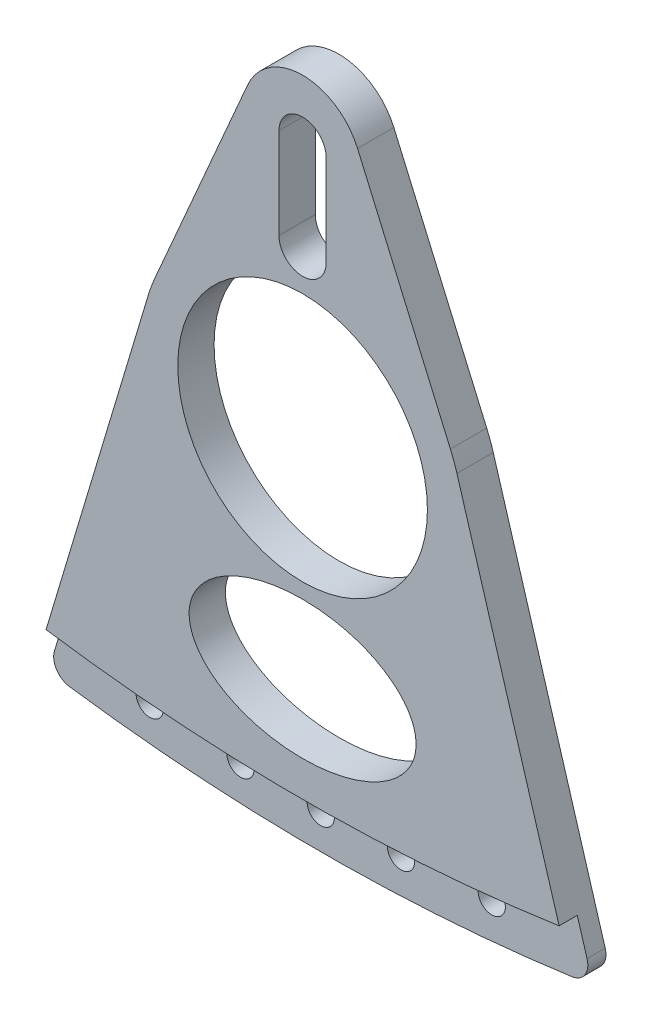
ISO-10303-21;
HEADER;
FILE_DESCRIPTION(('STEP AP214'),'2;1');
FILE_NAME('part.step','',(''),(''),'','','');
FILE_SCHEMA(('AUTOMOTIVE_DESIGN { 1 0 10303 214 1 1 1 1 }'));
ENDSEC;
DATA;
#1=APPLICATION_CONTEXT('core data for automotive mechanical design processes');
#2=APPLICATION_PROTOCOL_DEFINITION('international standard','automotive_design',2000,#1);
#3=PRODUCT_CONTEXT('',#1,'mechanical');
#4=PRODUCT('Part','Part','',(#3));
#5=PRODUCT_RELATED_PRODUCT_CATEGORY('part','',(#4));
#6=PRODUCT_DEFINITION_FORMATION('','',#4);
#7=PRODUCT_DEFINITION_CONTEXT('part definition',#1,'design');
#8=PRODUCT_DEFINITION('design','',#6,#7);
#9=PRODUCT_DEFINITION_SHAPE('','',#8);
#10=(LENGTH_UNIT() NAMED_UNIT(*) SI_UNIT(.MILLI.,.METRE.));
#11=(NAMED_UNIT(*) PLANE_ANGLE_UNIT() SI_UNIT($,.RADIAN.));
#12=(NAMED_UNIT(*) SI_UNIT($,.STERADIAN.) SOLID_ANGLE_UNIT());
#13=UNCERTAINTY_MEASURE_WITH_UNIT(LENGTH_MEASURE(1.E-05),#10,'distance_accuracy_value','');
#14=(GEOMETRIC_REPRESENTATION_CONTEXT(3) GLOBAL_UNCERTAINTY_ASSIGNED_CONTEXT((#13)) GLOBAL_UNIT_ASSIGNED_CONTEXT((#10,
#11,#12)) REPRESENTATION_CONTEXT('',''));
#15=CARTESIAN_POINT('',(0.,0.,0.));
#16=DIRECTION('',(0.,0.,1.));
#17=DIRECTION('',(1.,0.,0.));
#18=AXIS2_PLACEMENT_3D('',#15,#16,#17);
#19=CARTESIAN_POINT('',(0.,159.5,2.));
#20=DIRECTION('',(0.,0.,-1.));
#21=DIRECTION('',(-1.,0.,0.));
#22=AXIS2_PLACEMENT_3D('',#19,#20,#21);
#23=CYLINDRICAL_SURFACE('',#22,200.);
#24=CARTESIAN_POINT('',(0.,159.5,0.));
#25=DIRECTION('',(0.,0.,1.));
#26=DIRECTION('',(1.,0.,0.));
#27=AXIS2_PLACEMENT_3D('',#24,#25,#26);
#28=CIRCLE('',#27,200.);
#29=CARTESIAN_POINT('',(-27.6955851395141,-38.5731040898283,0.));
#30=VERTEX_POINT('',#29);
#31=CARTESIAN_POINT('',(27.695585139514,-38.5731040898283,0.));
#32=VERTEX_POINT('',#31);
#33=EDGE_CURVE('E182',#30,#32,#28,.T.);
#34=ORIENTED_EDGE('',*,*,#33,.F.);
#35=DIRECTION('',(0.,0.,-1.));
#36=VECTOR('',#35,1.);
#37=CARTESIAN_POINT('',(-27.695585139514,-38.5731040898283,2.));
#38=LINE('',#37,#36);
#39=CARTESIAN_POINT('',(-27.695585139514,-38.5731040898283,-2.));
#40=VERTEX_POINT('',#39);
#41=EDGE_CURVE('E297',#30,#40,#38,.T.);
#42=ORIENTED_EDGE('',*,*,#41,.T.);
#43=CARTESIAN_POINT('',(0.,159.5,-2.));
#44=DIRECTION('',(0.,0.,1.));
#45=DIRECTION('',(1.,0.,0.));
#46=AXIS2_PLACEMENT_3D('',#43,#44,#45);
#47=CIRCLE('',#46,200.);
#48=CARTESIAN_POINT('',(27.695585139514,-38.5731040898283,-2.));
#49=VERTEX_POINT('',#48);
#50=EDGE_CURVE('E303',#40,#49,#47,.T.);
#51=ORIENTED_EDGE('',*,*,#50,.T.);
#52=DIRECTION('',(0.,0.,-1.));
#53=VECTOR('',#52,1.);
#54=CARTESIAN_POINT('',(27.695585139514,-38.5731040898283,2.));
#55=LINE('',#54,#53);
#56=EDGE_CURVE('E51',#49,#32,#55,.F.);
#57=ORIENTED_EDGE('',*,*,#56,.T.);
#58=EDGE_LOOP('',(#34,#42,#51,#57));
#59=FACE_BOUND('',#58,.T.);
#60=ADVANCED_FACE('F42',(#59),#23,.T.);
#61=CARTESIAN_POINT('',(27.4186292881189,-36.59237304893,2.));
#62=DIRECTION('',(0.,0.,-1.));
#63=DIRECTION('',(-1.,0.,0.));
#64=AXIS2_PLACEMENT_3D('',#61,#62,#63);
#65=CYLINDRICAL_SURFACE('',#64,2.);
#66=DIRECTION('',(0.,0.,-1.));
#67=VECTOR('',#66,1.);
#68=CARTESIAN_POINT('',(29.334314751328,-36.0177869317559,2.));
#69=LINE('',#68,#67);
#70=CARTESIAN_POINT('',(29.334314751328,-36.0177869317559,0.));
#71=VERTEX_POINT('',#70);
#72=CARTESIAN_POINT('',(29.334314751328,-36.0177869317559,-2.));
#73=VERTEX_POINT('',#72);
#74=EDGE_CURVE('E279',#71,#73,#69,.T.);
#75=ORIENTED_EDGE('',*,*,#74,.F.);
#76=CARTESIAN_POINT('',(27.4186292881189,-36.59237304893,0.));
#77=DIRECTION('',(0.,0.,1.));
#78=DIRECTION('',(1.,0.,0.));
#79=AXIS2_PLACEMENT_3D('',#76,#77,#78);
#80=CIRCLE('',#79,1.99999999999999);
#81=EDGE_CURVE('E188',#32,#71,#80,.T.);
#82=ORIENTED_EDGE('',*,*,#81,.F.);
#83=ORIENTED_EDGE('',*,*,#56,.F.);
#84=CARTESIAN_POINT('',(27.4186292881189,-36.59237304893,-2.));
#85=DIRECTION('',(0.,0.,-1.));
#86=DIRECTION('',(-1.,0.,0.));
#87=AXIS2_PLACEMENT_3D('',#84,#85,#86);
#88=CIRCLE('',#87,2.);
#89=EDGE_CURVE('E282',#73,#49,#88,.T.);
#90=ORIENTED_EDGE('',*,*,#89,.F.);
#91=EDGE_LOOP('',(#75,#82,#83,#90));
#92=FACE_BOUND('',#91,.T.);
#93=ADVANCED_FACE('F256',(#92),#65,.T.);
#94=CARTESIAN_POINT('',(-27.4186292881188,-36.59237304893,2.));
#95=DIRECTION('',(0.,0.,-1.));
#96=DIRECTION('',(-1.,0.,0.));
#97=AXIS2_PLACEMENT_3D('',#94,#95,#96);
#98=CYLINDRICAL_SURFACE('',#97,2.);
#99=ORIENTED_EDGE('',*,*,#41,.F.);
#100=CARTESIAN_POINT('',(-27.4186292881188,-36.59237304893,0.));
#101=DIRECTION('',(0.,0.,1.));
#102=DIRECTION('',(1.,0.,0.));
#103=AXIS2_PLACEMENT_3D('',#100,#101,#102);
#104=CIRCLE('',#103,2.);
#105=CARTESIAN_POINT('',(-29.334314751328,-36.0177869317559,0.));
#106=VERTEX_POINT('',#105);
#107=EDGE_CURVE('E179',#106,#30,#104,.T.);
#108=ORIENTED_EDGE('',*,*,#107,.F.);
#109=DIRECTION('',(0.,0.,-1.));
#110=VECTOR('',#109,1.);
#111=CARTESIAN_POINT('',(-29.334314751328,-36.0177869317559,2.));
#112=LINE('',#111,#110);
#113=CARTESIAN_POINT('',(-29.334314751328,-36.0177869317559,-2.));
#114=VERTEX_POINT('',#113);
#115=EDGE_CURVE('E11',#114,#106,#112,.F.);
#116=ORIENTED_EDGE('',*,*,#115,.F.);
#117=CARTESIAN_POINT('',(-27.4186292881188,-36.59237304893,-2.));
#118=DIRECTION('',(0.,0.,-1.));
#119=DIRECTION('',(-1.,0.,0.));
#120=AXIS2_PLACEMENT_3D('',#117,#118,#119);
#121=CIRCLE('',#120,2.);
#122=EDGE_CURVE('E66',#40,#114,#121,.T.);
#123=ORIENTED_EDGE('',*,*,#122,.F.);
#124=EDGE_LOOP('',(#99,#108,#116,#123));
#125=FACE_BOUND('',#124,.T.);
#126=ADVANCED_FACE('F44',(#125),#98,.T.);
#127=CARTESIAN_POINT('',(0.,28.,2.));
#128=DIRECTION('',(0.,0.,-1.));
#129=DIRECTION('',(-1.,0.,0.));
#130=AXIS2_PLACEMENT_3D('',#127,#128,#129);
#131=PLANE('',#130);
#132=DIRECTION('',(-0.287293058587034,-0.957842731604571,0.));
#133=VECTOR('',#132,1.);
#134=CARTESIAN_POINT('',(-30.,-38.2371993328519,2.));
#135=LINE('',#134,#133);
#136=CARTESIAN_POINT('',(-17.0017084859811,5.09945178991986,2.));
#137=VERTEX_POINT('',#136);
#138=CARTESIAN_POINT('',(-28.2584637507619,-32.4308709573499,2.));
#139=VERTEX_POINT('',#138);
#140=EDGE_CURVE('E365',#137,#139,#135,.T.);
#141=ORIENTED_EDGE('',*,*,#140,.T.);
#142=CARTESIAN_POINT('',(0.,159.5,2.));
#143=DIRECTION('',(0.,0.,-1.));
#144=DIRECTION('',(1.,0.,0.));
#145=AXIS2_PLACEMENT_3D('',#142,#143,#144);
#146=CIRCLE('',#145,194.);
#147=CARTESIAN_POINT('',(28.2584637507619,-32.4308709573499,2.));
#148=VERTEX_POINT('',#147);
#149=EDGE_CURVE('E163',#148,#139,#146,.T.);
#150=ORIENTED_EDGE('',*,*,#149,.F.);
#151=DIRECTION('',(-0.287293058587035,0.957842731604571,0.));
#152=VECTOR('',#151,1.);
#153=CARTESIAN_POINT('',(30.,-38.2371993328519,2.));
#154=LINE('',#153,#152);
#155=CARTESIAN_POINT('',(17.0017084859811,5.09945178991986,2.));
#156=VERTEX_POINT('',#155);
#157=EDGE_CURVE('E362',#148,#156,#154,.T.);
#158=ORIENTED_EDGE('',*,*,#157,.T.);
#159=CARTESIAN_POINT('',(0.,0.,2.));
#160=DIRECTION('',(0.,0.,1.));
#161=DIRECTION('',(-1.,0.,0.));
#162=AXIS2_PLACEMENT_3D('',#159,#160,#161);
#163=CIRCLE('',#162,17.75);
#164=CARTESIAN_POINT('',(16.2819404440051,7.06830357142857,2.));
#165=VERTEX_POINT('',#164);
#166=EDGE_CURVE('E359',#156,#165,#163,.T.);
#167=ORIENTED_EDGE('',*,*,#166,.T.);
#168=DIRECTION('',(-0.398214285714286,0.917292419380571,0.));
#169=VECTOR('',#168,1.);
#170=CARTESIAN_POINT('',(6.05412996791176,30.6282142857143,2.));
#171=LINE('',#170,#169);
#172=CARTESIAN_POINT('',(6.05412996791176,30.6282142857143,2.));
#173=VERTEX_POINT('',#172);
#174=EDGE_CURVE('E327',#165,#173,#171,.T.);
#175=ORIENTED_EDGE('',*,*,#174,.T.);
#176=CARTESIAN_POINT('',(0.,28.,2.));
#177=DIRECTION('',(0.,0.,1.));
#178=DIRECTION('',(-1.,0.,0.));
#179=AXIS2_PLACEMENT_3D('',#176,#177,#178);
#180=CIRCLE('',#179,6.6);
#181=CARTESIAN_POINT('',(-6.05412996791176,30.6282142857143,2.));
#182=VERTEX_POINT('',#181);
#183=EDGE_CURVE('E321',#173,#182,#180,.T.);
#184=ORIENTED_EDGE('',*,*,#183,.T.);
#185=DIRECTION('',(-0.398214285714286,-0.917292419380571,0.));
#186=VECTOR('',#185,1.);
#187=CARTESIAN_POINT('',(-6.05412996791176,30.6282142857143,2.));
#188=LINE('',#187,#186);
#189=CARTESIAN_POINT('',(-16.2819404440051,7.06830357142857,2.));
#190=VERTEX_POINT('',#189);
#191=EDGE_CURVE('E370',#182,#190,#188,.T.);
#192=ORIENTED_EDGE('',*,*,#191,.T.);
#193=CARTESIAN_POINT('',(0.,0.,2.));
#194=DIRECTION('',(0.,0.,1.));
#195=DIRECTION('',(1.,0.,0.));
#196=AXIS2_PLACEMENT_3D('',#193,#194,#195);
#197=CIRCLE('',#196,17.75);
#198=EDGE_CURVE('E344',#190,#137,#197,.T.);
#199=ORIENTED_EDGE('',*,*,#198,.T.);
#200=EDGE_LOOP('',(#141,#150,#158,#167,#175,#184,#192,#199));
#201=FACE_BOUND('',#200,.T.);
#202=CARTESIAN_POINT('',(0.,18.,2.));
#203=DIRECTION('',(0.,0.,1.));
#204=DIRECTION('',(1.,0.,0.));
#205=AXIS2_PLACEMENT_3D('',#202,#203,#204);
#206=CIRCLE('',#205,2.6);
#207=CARTESIAN_POINT('',(-2.6,18.,2.));
#208=VERTEX_POINT('',#207);
#209=CARTESIAN_POINT('',(2.6,18.,2.));
#210=VERTEX_POINT('',#209);
#211=EDGE_CURVE('E394',#208,#210,#206,.T.);
#212=ORIENTED_EDGE('',*,*,#211,.F.);
#213=DIRECTION('',(0.,-1.,0.));
#214=VECTOR('',#213,1.);
#215=CARTESIAN_POINT('',(-2.6,18.,2.));
#216=LINE('',#215,#214);
#217=CARTESIAN_POINT('',(-2.6,28.,2.));
#218=VERTEX_POINT('',#217);
#219=EDGE_CURVE('E389',#218,#208,#216,.T.);
#220=ORIENTED_EDGE('',*,*,#219,.F.);
#221=CARTESIAN_POINT('',(0.,28.,2.));
#222=DIRECTION('',(0.,0.,1.));
#223=DIRECTION('',(1.,0.,0.));
#224=AXIS2_PLACEMENT_3D('',#221,#222,#223);
#225=CIRCLE('',#224,2.6);
#226=CARTESIAN_POINT('',(2.6,28.,2.));
#227=VERTEX_POINT('',#226);
#228=EDGE_CURVE('E410',#227,#218,#225,.T.);
#229=ORIENTED_EDGE('',*,*,#228,.F.);
#230=DIRECTION('',(0.,1.,0.));
#231=VECTOR('',#230,1.);
#232=CARTESIAN_POINT('',(2.6,18.,2.));
#233=LINE('',#232,#231);
#234=EDGE_CURVE('E414',#210,#227,#233,.T.);
#235=ORIENTED_EDGE('',*,*,#234,.F.);
#236=EDGE_LOOP('',(#212,#220,#229,#235));
#237=FACE_BOUND('',#236,.T.);
#238=CARTESIAN_POINT('',(0.,0.,2.));
#239=DIRECTION('',(0.,0.,1.));
#240=DIRECTION('',(1.,0.,0.));
#241=AXIS2_PLACEMENT_3D('',#238,#239,#240);
#242=CIRCLE('',#241,13.75);
#243=CARTESIAN_POINT('',(13.75,0.,2.));
#244=VERTEX_POINT('',#243);
#245=EDGE_CURVE('E407',#244,#244,#242,.T.);
#246=ORIENTED_EDGE('',*,*,#245,.F.);
#247=EDGE_LOOP('',(#246));
#248=FACE_BOUND('',#247,.T.);
#249=CARTESIAN_POINT('',(0.,-23.,2.));
#250=DIRECTION('',(0.,0.,1.));
#251=DIRECTION('',(-1.,0.,0.));
#252=AXIS2_PLACEMENT_3D('',#249,#250,#251);
#253=ELLIPSE('',#252,12.5,7.6);
#254=CARTESIAN_POINT('',(-12.5,-23.,2.));
#255=VERTEX_POINT('',#254);
#256=EDGE_CURVE('E199',#255,#255,#253,.T.);
#257=ORIENTED_EDGE('',*,*,#256,.F.);
#258=EDGE_LOOP('',(#257));
#259=FACE_BOUND('',#258,.T.);
#260=ADVANCED_FACE('F234',(#201,#237,#248,#259),#131,.F.);
#261=CARTESIAN_POINT('',(0.,28.,-2.));
#262=DIRECTION('',(0.,0.,-1.));
#263=DIRECTION('',(-1.,0.,0.));
#264=AXIS2_PLACEMENT_3D('',#261,#262,#263);
#265=PLANE('',#264);
#266=CARTESIAN_POINT('',(-18.8390986621441,-35.5925123155627,-2.));
#267=DIRECTION('',(0.,0.,1.));
#268=DIRECTION('',(1.,0.,0.));
#269=AXIS2_PLACEMENT_3D('',#266,#267,#268);
#270=CIRCLE('',#269,1.5);
#271=CARTESIAN_POINT('',(-17.3390986621441,-35.5925123155627,-2.));
#272=VERTEX_POINT('',#271);
#273=EDGE_CURVE('E195',#272,#272,#270,.T.);
#274=ORIENTED_EDGE('',*,*,#273,.T.);
#275=EDGE_LOOP('',(#274));
#276=FACE_BOUND('',#275,.T.);
#277=CARTESIAN_POINT('',(0.,-36.5,-2.));
#278=DIRECTION('',(0.,0.,1.));
#279=DIRECTION('',(1.,0.,0.));
#280=AXIS2_PLACEMENT_3D('',#277,#278,#279);
#281=CIRCLE('',#280,1.5);
#282=CARTESIAN_POINT('',(1.5,-36.5,-2.));
#283=VERTEX_POINT('',#282);
#284=EDGE_CURVE('E705',#283,#283,#281,.T.);
#285=ORIENTED_EDGE('',*,*,#284,.T.);
#286=EDGE_LOOP('',(#285));
#287=FACE_BOUND('',#286,.T.);
#288=CARTESIAN_POINT('',(18.8390986621441,-35.5925123155633,-2.));
#289=DIRECTION('',(0.,0.,1.));
#290=DIRECTION('',(-1.,0.,0.));
#291=AXIS2_PLACEMENT_3D('',#288,#289,#290);
#292=CIRCLE('',#291,1.50000000000001);
#293=CARTESIAN_POINT('',(17.3390986621441,-35.5925123155633,-2.));
#294=VERTEX_POINT('',#293);
#295=EDGE_CURVE('E697',#294,#294,#292,.T.);
#296=ORIENTED_EDGE('',*,*,#295,.T.);
#297=EDGE_LOOP('',(#296));
#298=FACE_BOUND('',#297,.T.);
#299=CARTESIAN_POINT('',(8.83909866214407,-36.3005881881895,-2.));
#300=DIRECTION('',(0.,0.,1.));
#301=DIRECTION('',(-1.,0.,0.));
#302=AXIS2_PLACEMENT_3D('',#299,#300,#301);
#303=CIRCLE('',#302,1.5);
#304=CARTESIAN_POINT('',(7.33909866214407,-36.3005881881895,-2.));
#305=VERTEX_POINT('',#304);
#306=EDGE_CURVE('E696',#305,#305,#303,.T.);
#307=ORIENTED_EDGE('',*,*,#306,.T.);
#308=EDGE_LOOP('',(#307));
#309=FACE_BOUND('',#308,.T.);
#310=CARTESIAN_POINT('',(-8.83909866214407,-36.3005881881893,-2.));
#311=DIRECTION('',(0.,0.,1.));
#312=DIRECTION('',(1.,0.,0.));
#313=AXIS2_PLACEMENT_3D('',#310,#311,#312);
#314=CIRCLE('',#313,1.5);
#315=CARTESIAN_POINT('',(-7.33909866214406,-36.3005881881893,-2.));
#316=VERTEX_POINT('',#315);
#317=EDGE_CURVE('E689',#316,#316,#314,.T.);
#318=ORIENTED_EDGE('',*,*,#317,.T.);
#319=EDGE_LOOP('',(#318));
#320=FACE_BOUND('',#319,.T.);
#321=CARTESIAN_POINT('',(0.,0.,-2.));
#322=DIRECTION('',(0.,0.,1.));
#323=DIRECTION('',(1.,0.,0.));
#324=AXIS2_PLACEMENT_3D('',#321,#322,#323);
#325=CIRCLE('',#324,13.75);
#326=CARTESIAN_POINT('',(13.75,0.,-2.));
#327=VERTEX_POINT('',#326);
#328=EDGE_CURVE('E204',#327,#327,#325,.T.);
#329=ORIENTED_EDGE('',*,*,#328,.T.);
#330=EDGE_LOOP('',(#329));
#331=FACE_BOUND('',#330,.T.);
#332=DIRECTION('',(-0.287293058587035,0.957842731604571,0.));
#333=VECTOR('',#332,1.);
#334=CARTESIAN_POINT('',(30.,-38.2371993328519,-2.));
#335=LINE('',#334,#333);
#336=CARTESIAN_POINT('',(17.0017084859811,5.09945178991986,-2.));
#337=VERTEX_POINT('',#336);
#338=EDGE_CURVE('E305',#73,#337,#335,.T.);
#339=ORIENTED_EDGE('',*,*,#338,.F.);
#340=ORIENTED_EDGE('',*,*,#89,.T.);
#341=ORIENTED_EDGE('',*,*,#50,.F.);
#342=ORIENTED_EDGE('',*,*,#122,.T.);
#343=DIRECTION('',(-0.287293058587034,-0.957842731604571,0.));
#344=VECTOR('',#343,1.);
#345=CARTESIAN_POINT('',(-30.,-38.2371993328519,-2.));
#346=LINE('',#345,#344);
#347=CARTESIAN_POINT('',(-17.0017084859811,5.09945178991986,-2.));
#348=VERTEX_POINT('',#347);
#349=EDGE_CURVE('E306',#348,#114,#346,.T.);
#350=ORIENTED_EDGE('',*,*,#349,.F.);
#351=CARTESIAN_POINT('',(0.,0.,-2.));
#352=DIRECTION('',(0.,0.,1.));
#353=DIRECTION('',(1.,0.,0.));
#354=AXIS2_PLACEMENT_3D('',#351,#352,#353);
#355=CIRCLE('',#354,17.75);
#356=CARTESIAN_POINT('',(-16.2819404440051,7.06830357142857,-2.));
#357=VERTEX_POINT('',#356);
#358=EDGE_CURVE('E312',#357,#348,#355,.T.);
#359=ORIENTED_EDGE('',*,*,#358,.F.);
#360=DIRECTION('',(-0.398214285714286,-0.917292419380571,0.));
#361=VECTOR('',#360,1.);
#362=CARTESIAN_POINT('',(-6.05412996791176,30.6282142857143,-2.));
#363=LINE('',#362,#361);
#364=CARTESIAN_POINT('',(-6.05412996791176,30.6282142857143,-2.));
#365=VERTEX_POINT('',#364);
#366=EDGE_CURVE('E347',#365,#357,#363,.T.);
#367=ORIENTED_EDGE('',*,*,#366,.F.);
#368=CARTESIAN_POINT('',(0.,28.,-2.));
#369=DIRECTION('',(0.,0.,1.));
#370=DIRECTION('',(-1.,0.,0.));
#371=AXIS2_PLACEMENT_3D('',#368,#369,#370);
#372=CIRCLE('',#371,6.6);
#373=CARTESIAN_POINT('',(6.05412996791176,30.6282142857143,-2.));
#374=VERTEX_POINT('',#373);
#375=EDGE_CURVE('E350',#374,#365,#372,.T.);
#376=ORIENTED_EDGE('',*,*,#375,.F.);
#377=DIRECTION('',(-0.398214285714286,0.917292419380571,0.));
#378=VECTOR('',#377,1.);
#379=CARTESIAN_POINT('',(6.05412996791176,30.6282142857143,-2.));
#380=LINE('',#379,#378);
#381=CARTESIAN_POINT('',(16.2819404440051,7.06830357142857,-2.));
#382=VERTEX_POINT('',#381);
#383=EDGE_CURVE('E318',#382,#374,#380,.T.);
#384=ORIENTED_EDGE('',*,*,#383,.F.);
#385=CARTESIAN_POINT('',(0.,0.,-2.));
#386=DIRECTION('',(0.,0.,1.));
#387=DIRECTION('',(-1.,0.,0.));
#388=AXIS2_PLACEMENT_3D('',#385,#386,#387);
#389=CIRCLE('',#388,17.75);
#390=EDGE_CURVE('E310',#337,#382,#389,.T.);
#391=ORIENTED_EDGE('',*,*,#390,.F.);
#392=EDGE_LOOP('',(#339,#340,#341,#342,#350,#359,#367,#376,#384,#391));
#393=FACE_BOUND('',#392,.T.);
#394=DIRECTION('',(0.,-1.,0.));
#395=VECTOR('',#394,1.);
#396=CARTESIAN_POINT('',(-2.6,18.,-2.));
#397=LINE('',#396,#395);
#398=CARTESIAN_POINT('',(-2.6,28.,-2.));
#399=VERTEX_POINT('',#398);
#400=CARTESIAN_POINT('',(-2.6,18.,-2.));
#401=VERTEX_POINT('',#400);
#402=EDGE_CURVE('E390',#399,#401,#397,.T.);
#403=ORIENTED_EDGE('',*,*,#402,.T.);
#404=CARTESIAN_POINT('',(0.,18.,-2.));
#405=DIRECTION('',(0.,0.,1.));
#406=DIRECTION('',(1.,0.,0.));
#407=AXIS2_PLACEMENT_3D('',#404,#405,#406);
#408=CIRCLE('',#407,2.6);
#409=CARTESIAN_POINT('',(2.6,18.,-2.));
#410=VERTEX_POINT('',#409);
#411=EDGE_CURVE('E403',#401,#410,#408,.T.);
#412=ORIENTED_EDGE('',*,*,#411,.T.);
#413=DIRECTION('',(0.,1.,0.));
#414=VECTOR('',#413,1.);
#415=CARTESIAN_POINT('',(2.6,18.,-2.));
#416=LINE('',#415,#414);
#417=CARTESIAN_POINT('',(2.6,28.,-2.));
#418=VERTEX_POINT('',#417);
#419=EDGE_CURVE('E399',#410,#418,#416,.T.);
#420=ORIENTED_EDGE('',*,*,#419,.T.);
#421=CARTESIAN_POINT('',(0.,28.,-2.));
#422=DIRECTION('',(0.,0.,1.));
#423=DIRECTION('',(1.,0.,0.));
#424=AXIS2_PLACEMENT_3D('',#421,#422,#423);
#425=CIRCLE('',#424,2.6);
#426=EDGE_CURVE('E395',#418,#399,#425,.T.);
#427=ORIENTED_EDGE('',*,*,#426,.T.);
#428=EDGE_LOOP('',(#403,#412,#420,#427));
#429=FACE_BOUND('',#428,.T.);
#430=CARTESIAN_POINT('',(0.,-23.,-2.));
#431=DIRECTION('',(0.,0.,1.));
#432=DIRECTION('',(-1.,0.,0.));
#433=AXIS2_PLACEMENT_3D('',#430,#431,#432);
#434=ELLIPSE('',#433,12.5,7.6);
#435=CARTESIAN_POINT('',(-12.5,-23.,-2.));
#436=VERTEX_POINT('',#435);
#437=EDGE_CURVE('E197',#436,#436,#434,.T.);
#438=ORIENTED_EDGE('',*,*,#437,.T.);
#439=EDGE_LOOP('',(#438));
#440=FACE_BOUND('',#439,.T.);
#441=ADVANCED_FACE('F237',(#276,#287,#298,#309,#320,#331,#393,#429,#440),#265,.T.);
#442=CARTESIAN_POINT('',(0.,28.,2.));
#443=DIRECTION('',(0.,0.,-1.));
#444=DIRECTION('',(-1.,0.,0.));
#445=AXIS2_PLACEMENT_3D('',#442,#443,#444);
#446=CYLINDRICAL_SURFACE('',#445,6.6);
#447=ORIENTED_EDGE('',*,*,#375,.T.);
#448=DIRECTION('',(0.,0.,-1.));
#449=VECTOR('',#448,1.);
#450=CARTESIAN_POINT('',(-6.05412996791176,30.6282142857143,2.));
#451=LINE('',#450,#449);
#452=EDGE_CURVE('E285',#182,#365,#451,.T.);
#453=ORIENTED_EDGE('',*,*,#452,.F.);
#454=ORIENTED_EDGE('',*,*,#183,.F.);
#455=DIRECTION('',(0.,0.,-1.));
#456=VECTOR('',#455,1.);
#457=CARTESIAN_POINT('',(6.05412996791176,30.6282142857143,2.));
#458=LINE('',#457,#456);
#459=EDGE_CURVE('E322',#173,#374,#458,.T.);
#460=ORIENTED_EDGE('',*,*,#459,.T.);
#461=EDGE_LOOP('',(#447,#453,#454,#460));
#462=FACE_BOUND('',#461,.T.);
#463=ADVANCED_FACE('F241',(#462),#446,.T.);
#464=CARTESIAN_POINT('',(-6.05412996791176,30.6282142857143,2.));
#465=DIRECTION('',(0.917292419380571,-0.398214285714286,0.));
#466=DIRECTION('',(0.398214285714286,0.917292419380571,0.));
#467=AXIS2_PLACEMENT_3D('',#464,#465,#466);
#468=PLANE('',#467);
#469=ORIENTED_EDGE('',*,*,#366,.T.);
#470=DIRECTION('',(0.,0.,-1.));
#471=VECTOR('',#470,1.);
#472=CARTESIAN_POINT('',(-16.2819404440051,7.06830357142857,2.));
#473=LINE('',#472,#471);
#474=EDGE_CURVE('E291',#190,#357,#473,.T.);
#475=ORIENTED_EDGE('',*,*,#474,.F.);
#476=ORIENTED_EDGE('',*,*,#191,.F.);
#477=ORIENTED_EDGE('',*,*,#452,.T.);
#478=EDGE_LOOP('',(#469,#475,#476,#477));
#479=FACE_BOUND('',#478,.T.);
#480=ADVANCED_FACE('F263',(#479),#468,.F.);
#481=CARTESIAN_POINT('',(0.,0.,2.));
#482=DIRECTION('',(0.,0.,-1.));
#483=DIRECTION('',(-1.,0.,0.));
#484=AXIS2_PLACEMENT_3D('',#481,#482,#483);
#485=CYLINDRICAL_SURFACE('',#484,17.75);
#486=ORIENTED_EDGE('',*,*,#358,.T.);
#487=DIRECTION('',(0.,0.,-1.));
#488=VECTOR('',#487,1.);
#489=CARTESIAN_POINT('',(-17.0017084859811,5.09945178991986,2.));
#490=LINE('',#489,#488);
#491=EDGE_CURVE('E335',#137,#348,#490,.T.);
#492=ORIENTED_EDGE('',*,*,#491,.F.);
#493=ORIENTED_EDGE('',*,*,#198,.F.);
#494=ORIENTED_EDGE('',*,*,#474,.T.);
#495=EDGE_LOOP('',(#486,#492,#493,#494));
#496=FACE_BOUND('',#495,.T.);
#497=ADVANCED_FACE('F260',(#496),#485,.T.);
#498=CARTESIAN_POINT('',(-30.,-38.2371993328519,2.));
#499=DIRECTION('',(0.957842731604571,-0.287293058587034,0.));
#500=DIRECTION('',(0.287293058587034,0.957842731604571,0.));
#501=AXIS2_PLACEMENT_3D('',#498,#499,#500);
#502=PLANE('',#501);
#503=DIRECTION('',(-0.287293058587025,-0.957842731604574,0.));
#504=VECTOR('',#503,1.);
#505=CARTESIAN_POINT('',(-28.2584637507619,-32.4308709573499,0.));
#506=LINE('',#505,#504);
#507=CARTESIAN_POINT('',(-28.2584637507619,-32.4308709573499,0.));
#508=VERTEX_POINT('',#507);
#509=EDGE_CURVE('E58',#508,#106,#506,.T.);
#510=ORIENTED_EDGE('',*,*,#509,.F.);
#511=DIRECTION('',(0.,0.,1.));
#512=VECTOR('',#511,1.);
#513=CARTESIAN_POINT('',(-28.2584637507619,-32.4308709573499,0.));
#514=LINE('',#513,#512);
#515=EDGE_CURVE('E158',#508,#139,#514,.T.);
#516=ORIENTED_EDGE('',*,*,#515,.T.);
#517=ORIENTED_EDGE('',*,*,#140,.F.);
#518=ORIENTED_EDGE('',*,*,#491,.T.);
#519=ORIENTED_EDGE('',*,*,#349,.T.);
#520=ORIENTED_EDGE('',*,*,#115,.T.);
#521=EDGE_LOOP('',(#510,#516,#517,#518,#519,#520));
#522=FACE_BOUND('',#521,.T.);
#523=ADVANCED_FACE('F176',(#522),#502,.F.);
#524=CARTESIAN_POINT('',(30.,-38.2371993328519,2.));
#525=DIRECTION('',(-0.957842731604571,-0.287293058587035,0.));
#526=DIRECTION('',(0.287293058587035,-0.957842731604571,0.));
#527=AXIS2_PLACEMENT_3D('',#524,#525,#526);
#528=PLANE('',#527);
#529=ORIENTED_EDGE('',*,*,#157,.F.);
#530=DIRECTION('',(0.,0.,1.));
#531=VECTOR('',#530,1.);
#532=CARTESIAN_POINT('',(28.2584637507619,-32.4308709573499,0.));
#533=LINE('',#532,#531);
#534=CARTESIAN_POINT('',(28.2584637507619,-32.4308709573499,0.));
#535=VERTEX_POINT('',#534);
#536=EDGE_CURVE('E168',#535,#148,#533,.T.);
#537=ORIENTED_EDGE('',*,*,#536,.F.);
#538=DIRECTION('',(-0.287293058587027,0.957842731604573,0.));
#539=VECTOR('',#538,1.);
#540=CARTESIAN_POINT('',(29.334314751328,-36.0177869317559,0.));
#541=LINE('',#540,#539);
#542=EDGE_CURVE('E169',#71,#535,#541,.T.);
#543=ORIENTED_EDGE('',*,*,#542,.F.);
#544=ORIENTED_EDGE('',*,*,#74,.T.);
#545=ORIENTED_EDGE('',*,*,#338,.T.);
#546=DIRECTION('',(0.,0.,-1.));
#547=VECTOR('',#546,1.);
#548=CARTESIAN_POINT('',(17.0017084859811,5.09945178991986,2.));
#549=LINE('',#548,#547);
#550=EDGE_CURVE('E331',#156,#337,#549,.T.);
#551=ORIENTED_EDGE('',*,*,#550,.F.);
#552=EDGE_LOOP('',(#529,#537,#543,#544,#545,#551));
#553=FACE_BOUND('',#552,.T.);
#554=ADVANCED_FACE('F249',(#553),#528,.F.);
#555=CARTESIAN_POINT('',(0.,0.,2.));
#556=DIRECTION('',(0.,0.,-1.));
#557=DIRECTION('',(-1.,0.,0.));
#558=AXIS2_PLACEMENT_3D('',#555,#556,#557);
#559=CYLINDRICAL_SURFACE('',#558,17.75);
#560=ORIENTED_EDGE('',*,*,#390,.T.);
#561=DIRECTION('',(0.,0.,-1.));
#562=VECTOR('',#561,1.);
#563=CARTESIAN_POINT('',(16.2819404440051,7.06830357142857,2.));
#564=LINE('',#563,#562);
#565=EDGE_CURVE('E326',#165,#382,#564,.T.);
#566=ORIENTED_EDGE('',*,*,#565,.F.);
#567=ORIENTED_EDGE('',*,*,#166,.F.);
#568=ORIENTED_EDGE('',*,*,#550,.T.);
#569=EDGE_LOOP('',(#560,#566,#567,#568));
#570=FACE_BOUND('',#569,.T.);
#571=ADVANCED_FACE('F245',(#570),#559,.T.);
#572=CARTESIAN_POINT('',(6.05412996791176,30.6282142857143,2.));
#573=DIRECTION('',(-0.917292419380571,-0.398214285714286,0.));
#574=DIRECTION('',(0.398214285714286,-0.917292419380571,0.));
#575=AXIS2_PLACEMENT_3D('',#572,#573,#574);
#576=PLANE('',#575);
#577=ORIENTED_EDGE('',*,*,#383,.T.);
#578=ORIENTED_EDGE('',*,*,#459,.F.);
#579=ORIENTED_EDGE('',*,*,#174,.F.);
#580=ORIENTED_EDGE('',*,*,#565,.T.);
#581=EDGE_LOOP('',(#577,#578,#579,#580));
#582=FACE_BOUND('',#581,.T.);
#583=ADVANCED_FACE('F232',(#582),#576,.F.);
#584=CARTESIAN_POINT('',(0.,18.,2.));
#585=DIRECTION('',(0.,0.,-1.));
#586=DIRECTION('',(-1.,0.,0.));
#587=AXIS2_PLACEMENT_3D('',#584,#585,#586);
#588=CYLINDRICAL_SURFACE('',#587,2.6);
#589=ORIENTED_EDGE('',*,*,#411,.F.);
#590=DIRECTION('',(0.,0.,-1.));
#591=VECTOR('',#590,1.);
#592=CARTESIAN_POINT('',(-2.6,18.,2.));
#593=LINE('',#592,#591);
#594=EDGE_CURVE('E385',#208,#401,#593,.T.);
#595=ORIENTED_EDGE('',*,*,#594,.F.);
#596=ORIENTED_EDGE('',*,*,#211,.T.);
#597=DIRECTION('',(0.,0.,-1.));
#598=VECTOR('',#597,1.);
#599=CARTESIAN_POINT('',(2.6,18.,2.));
#600=LINE('',#599,#598);
#601=EDGE_CURVE('E356',#210,#410,#600,.T.);
#602=ORIENTED_EDGE('',*,*,#601,.T.);
#603=EDGE_LOOP('',(#589,#595,#596,#602));
#604=FACE_BOUND('',#603,.T.);
#605=ADVANCED_FACE('F228',(#604),#588,.F.);
#606=CARTESIAN_POINT('',(2.6,18.,2.));
#607=DIRECTION('',(-1.,0.,0.));
#608=DIRECTION('',(0.,0.,1.));
#609=AXIS2_PLACEMENT_3D('',#606,#607,#608);
#610=PLANE('',#609);
#611=ORIENTED_EDGE('',*,*,#419,.F.);
#612=ORIENTED_EDGE('',*,*,#601,.F.);
#613=ORIENTED_EDGE('',*,*,#234,.T.);
#614=DIRECTION('',(0.,0.,-1.));
#615=VECTOR('',#614,1.);
#616=CARTESIAN_POINT('',(2.6,28.,2.));
#617=LINE('',#616,#615);
#618=EDGE_CURVE('E379',#227,#418,#617,.T.);
#619=ORIENTED_EDGE('',*,*,#618,.T.);
#620=EDGE_LOOP('',(#611,#612,#613,#619));
#621=FACE_BOUND('',#620,.T.);
#622=ADVANCED_FACE('F224',(#621),#610,.T.);
#623=CARTESIAN_POINT('',(0.,28.,2.));
#624=DIRECTION('',(0.,0.,-1.));
#625=DIRECTION('',(-1.,0.,0.));
#626=AXIS2_PLACEMENT_3D('',#623,#624,#625);
#627=CYLINDRICAL_SURFACE('',#626,2.6);
#628=ORIENTED_EDGE('',*,*,#426,.F.);
#629=ORIENTED_EDGE('',*,*,#618,.F.);
#630=ORIENTED_EDGE('',*,*,#228,.T.);
#631=DIRECTION('',(0.,0.,-1.));
#632=VECTOR('',#631,1.);
#633=CARTESIAN_POINT('',(-2.6,28.,2.));
#634=LINE('',#633,#632);
#635=EDGE_CURVE('E382',#218,#399,#634,.T.);
#636=ORIENTED_EDGE('',*,*,#635,.T.);
#637=EDGE_LOOP('',(#628,#629,#630,#636));
#638=FACE_BOUND('',#637,.T.);
#639=ADVANCED_FACE('F220',(#638),#627,.F.);
#640=CARTESIAN_POINT('',(-2.6,18.,2.));
#641=DIRECTION('',(1.,0.,0.));
#642=DIRECTION('',(0.,0.,-1.));
#643=AXIS2_PLACEMENT_3D('',#640,#641,#642);
#644=PLANE('',#643);
#645=ORIENTED_EDGE('',*,*,#402,.F.);
#646=ORIENTED_EDGE('',*,*,#635,.F.);
#647=ORIENTED_EDGE('',*,*,#219,.T.);
#648=ORIENTED_EDGE('',*,*,#594,.T.);
#649=EDGE_LOOP('',(#645,#646,#647,#648));
#650=FACE_BOUND('',#649,.T.);
#651=ADVANCED_FACE('F216',(#650),#644,.T.);
#652=CARTESIAN_POINT('',(0.,0.,2.));
#653=DIRECTION('',(0.,0.,-1.));
#654=DIRECTION('',(-1.,0.,0.));
#655=AXIS2_PLACEMENT_3D('',#652,#653,#654);
#656=CYLINDRICAL_SURFACE('',#655,13.75);
#657=ORIENTED_EDGE('',*,*,#245,.T.);
#658=EDGE_LOOP('',(#657));
#659=FACE_BOUND('',#658,.T.);
#660=ORIENTED_EDGE('',*,*,#328,.F.);
#661=EDGE_LOOP('',(#660));
#662=FACE_BOUND('',#661,.T.);
#663=ADVANCED_FACE('F211',(#659,#662),#656,.F.);
#664=DIRECTION('',(0.,0.,-1.));
#665=VECTOR('',#664,1.);
#666=SURFACE_OF_LINEAR_EXTRUSION('',#253,#665);
#667=ORIENTED_EDGE('',*,*,#256,.T.);
#668=EDGE_LOOP('',(#667));
#669=FACE_BOUND('',#668,.T.);
#670=ORIENTED_EDGE('',*,*,#437,.F.);
#671=EDGE_LOOP('',(#670));
#672=FACE_BOUND('',#671,.T.);
#673=ADVANCED_FACE('F207',(#669,#672),#666,.T.);
#674=CARTESIAN_POINT('',(0.,159.5,0.));
#675=DIRECTION('',(0.,0.,1.));
#676=DIRECTION('',(1.,0.,0.));
#677=AXIS2_PLACEMENT_3D('',#674,#675,#676);
#678=CYLINDRICAL_SURFACE('',#677,194.);
#679=ORIENTED_EDGE('',*,*,#149,.T.);
#680=ORIENTED_EDGE('',*,*,#515,.F.);
#681=CARTESIAN_POINT('',(0.,159.5,0.));
#682=DIRECTION('',(0.,0.,-1.));
#683=DIRECTION('',(1.,0.,0.));
#684=AXIS2_PLACEMENT_3D('',#681,#682,#683);
#685=CIRCLE('',#684,194.);
#686=EDGE_CURVE('E160',#535,#508,#685,.T.);
#687=ORIENTED_EDGE('',*,*,#686,.F.);
#688=ORIENTED_EDGE('',*,*,#536,.T.);
#689=EDGE_LOOP('',(#679,#680,#687,#688));
#690=FACE_BOUND('',#689,.T.);
#691=ADVANCED_FACE('F159',(#690),#678,.T.);
#692=CARTESIAN_POINT('',(0.,159.5,0.));
#693=DIRECTION('',(0.,0.,1.));
#694=DIRECTION('',(1.,0.,0.));
#695=AXIS2_PLACEMENT_3D('',#692,#693,#694);
#696=PLANE('',#695);
#697=CARTESIAN_POINT('',(-18.8390986621441,-35.5925123155627,0.));
#698=DIRECTION('',(0.,0.,1.));
#699=DIRECTION('',(1.,0.,0.));
#700=AXIS2_PLACEMENT_3D('',#697,#698,#699);
#701=CIRCLE('',#700,1.5);
#702=CARTESIAN_POINT('',(-17.3390986621441,-35.5925123155627,0.));
#703=VERTEX_POINT('',#702);
#704=EDGE_CURVE('E681',#703,#703,#701,.T.);
#705=ORIENTED_EDGE('',*,*,#704,.F.);
#706=EDGE_LOOP('',(#705));
#707=FACE_BOUND('',#706,.T.);
#708=CARTESIAN_POINT('',(0.,-36.5,0.));
#709=DIRECTION('',(0.,0.,1.));
#710=DIRECTION('',(1.,0.,0.));
#711=AXIS2_PLACEMENT_3D('',#708,#709,#710);
#712=CIRCLE('',#711,1.5);
#713=CARTESIAN_POINT('',(1.5,-36.5,0.));
#714=VERTEX_POINT('',#713);
#715=EDGE_CURVE('E701',#714,#714,#712,.T.);
#716=ORIENTED_EDGE('',*,*,#715,.F.);
#717=EDGE_LOOP('',(#716));
#718=FACE_BOUND('',#717,.T.);
#719=CARTESIAN_POINT('',(18.8390986621441,-35.5925123155633,0.));
#720=DIRECTION('',(0.,0.,1.));
#721=DIRECTION('',(-1.,0.,0.));
#722=AXIS2_PLACEMENT_3D('',#719,#720,#721);
#723=CIRCLE('',#722,1.50000000000001);
#724=CARTESIAN_POINT('',(17.3390986621441,-35.5925123155633,0.));
#725=VERTEX_POINT('',#724);
#726=EDGE_CURVE('E692',#725,#725,#723,.T.);
#727=ORIENTED_EDGE('',*,*,#726,.F.);
#728=EDGE_LOOP('',(#727));
#729=FACE_BOUND('',#728,.T.);
#730=CARTESIAN_POINT('',(8.83909866214407,-36.3005881881895,0.));
#731=DIRECTION('',(0.,0.,1.));
#732=DIRECTION('',(-1.,0.,0.));
#733=AXIS2_PLACEMENT_3D('',#730,#731,#732);
#734=CIRCLE('',#733,1.5);
#735=CARTESIAN_POINT('',(7.33909866214407,-36.3005881881895,0.));
#736=VERTEX_POINT('',#735);
#737=EDGE_CURVE('E712',#736,#736,#734,.T.);
#738=ORIENTED_EDGE('',*,*,#737,.F.);
#739=EDGE_LOOP('',(#738));
#740=FACE_BOUND('',#739,.T.);
#741=CARTESIAN_POINT('',(-8.83909866214407,-36.3005881881893,0.));
#742=DIRECTION('',(0.,0.,1.));
#743=DIRECTION('',(1.,0.,0.));
#744=AXIS2_PLACEMENT_3D('',#741,#742,#743);
#745=CIRCLE('',#744,1.5);
#746=CARTESIAN_POINT('',(-7.33909866214406,-36.3005881881893,0.));
#747=VERTEX_POINT('',#746);
#748=EDGE_CURVE('E683',#747,#747,#745,.T.);
#749=ORIENTED_EDGE('',*,*,#748,.F.);
#750=EDGE_LOOP('',(#749));
#751=FACE_BOUND('',#750,.T.);
#752=ORIENTED_EDGE('',*,*,#686,.T.);
#753=ORIENTED_EDGE('',*,*,#509,.T.);
#754=ORIENTED_EDGE('',*,*,#107,.T.);
#755=ORIENTED_EDGE('',*,*,#33,.T.);
#756=ORIENTED_EDGE('',*,*,#81,.T.);
#757=ORIENTED_EDGE('',*,*,#542,.T.);
#758=EDGE_LOOP('',(#752,#753,#754,#755,#756,#757));
#759=FACE_BOUND('',#758,.T.);
#760=ADVANCED_FACE('F171',(#707,#718,#729,#740,#751,#759),#696,.T.);
#761=CARTESIAN_POINT('',(-8.83909866214407,-36.3005881881893,-2.));
#762=DIRECTION('',(0.,0.,1.));
#763=DIRECTION('',(1.,0.,0.));
#764=AXIS2_PLACEMENT_3D('',#761,#762,#763);
#765=CYLINDRICAL_SURFACE('',#764,1.5);
#766=ORIENTED_EDGE('',*,*,#317,.F.);
#767=EDGE_LOOP('',(#766));
#768=FACE_BOUND('',#767,.T.);
#769=ORIENTED_EDGE('',*,*,#748,.T.);
#770=EDGE_LOOP('',(#769));
#771=FACE_BOUND('',#770,.T.);
#772=ADVANCED_FACE('F491',(#768,#771),#765,.F.);
#773=CARTESIAN_POINT('',(8.83909866214407,-36.3005881881895,-2.));
#774=DIRECTION('',(0.,0.,1.));
#775=DIRECTION('',(1.,0.,0.));
#776=AXIS2_PLACEMENT_3D('',#773,#774,#775);
#777=CYLINDRICAL_SURFACE('',#776,1.5);
#778=ORIENTED_EDGE('',*,*,#306,.F.);
#779=EDGE_LOOP('',(#778));
#780=FACE_BOUND('',#779,.T.);
#781=ORIENTED_EDGE('',*,*,#737,.T.);
#782=EDGE_LOOP('',(#781));
#783=FACE_BOUND('',#782,.T.);
#784=ADVANCED_FACE('F501',(#780,#783),#777,.F.);
#785=CARTESIAN_POINT('',(18.8390986621441,-35.5925123155633,-2.));
#786=DIRECTION('',(0.,0.,1.));
#787=DIRECTION('',(1.,0.,0.));
#788=AXIS2_PLACEMENT_3D('',#785,#786,#787);
#789=CYLINDRICAL_SURFACE('',#788,1.50000000000001);
#790=ORIENTED_EDGE('',*,*,#295,.F.);
#791=EDGE_LOOP('',(#790));
#792=FACE_BOUND('',#791,.T.);
#793=ORIENTED_EDGE('',*,*,#726,.T.);
#794=EDGE_LOOP('',(#793));
#795=FACE_BOUND('',#794,.T.);
#796=ADVANCED_FACE('F512',(#792,#795),#789,.F.);
#797=CARTESIAN_POINT('',(0.,-36.5,-2.));
#798=DIRECTION('',(0.,0.,1.));
#799=DIRECTION('',(1.,0.,0.));
#800=AXIS2_PLACEMENT_3D('',#797,#798,#799);
#801=CYLINDRICAL_SURFACE('',#800,1.5);
#802=ORIENTED_EDGE('',*,*,#284,.F.);
#803=EDGE_LOOP('',(#802));
#804=FACE_BOUND('',#803,.T.);
#805=ORIENTED_EDGE('',*,*,#715,.T.);
#806=EDGE_LOOP('',(#805));
#807=FACE_BOUND('',#806,.T.);
#808=ADVANCED_FACE('F523',(#804,#807),#801,.F.);
#809=CARTESIAN_POINT('',(-18.8390986621441,-35.5925123155627,-2.));
#810=DIRECTION('',(0.,0.,1.));
#811=DIRECTION('',(1.,0.,0.));
#812=AXIS2_PLACEMENT_3D('',#809,#810,#811);
#813=CYLINDRICAL_SURFACE('',#812,1.5);
#814=ORIENTED_EDGE('',*,*,#273,.F.);
#815=EDGE_LOOP('',(#814));
#816=FACE_BOUND('',#815,.T.);
#817=ORIENTED_EDGE('',*,*,#704,.T.);
#818=EDGE_LOOP('',(#817));
#819=FACE_BOUND('',#818,.T.);
#820=ADVANCED_FACE('F534',(#816,#819),#813,.F.);
#821=CLOSED_SHELL('',(#60,#93,#126,#260,#441,#463,#480,#497,#523,#554,#571,#583,#605,#622,#639,
#651,#663,#673,#691,#760,#772,#784,#796,#808,#820));
#822=MANIFOLD_SOLID_BREP('B2',#821);
#823=ADVANCED_BREP_SHAPE_REPRESENTATION('',(#18,#822),#14);
#824=SHAPE_DEFINITION_REPRESENTATION(#9,#823);
ENDSEC;
END-ISO-10303-21;
